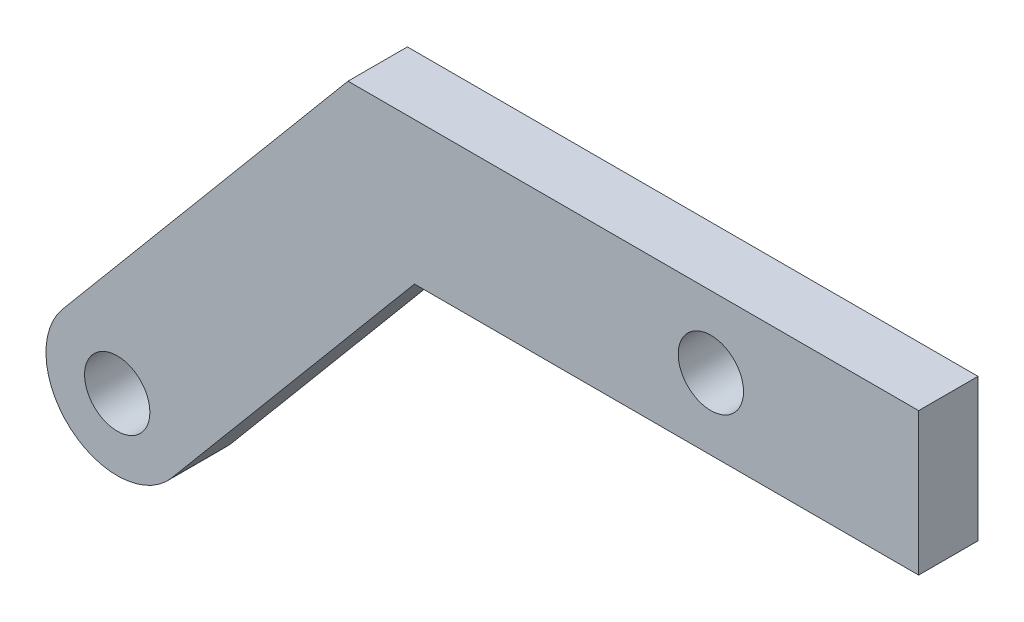
ISO-10303-21;
HEADER;
FILE_DESCRIPTION(('STEP AP214'),'2;1');
FILE_NAME('part.step','',(''),(''),'','','');
FILE_SCHEMA(('AUTOMOTIVE_DESIGN { 1 0 10303 214 1 1 1 1 }'));
ENDSEC;
DATA;
#1=APPLICATION_CONTEXT('core data for automotive mechanical design processes');
#2=APPLICATION_PROTOCOL_DEFINITION('international standard','automotive_design',2000,#1);
#3=PRODUCT_CONTEXT('',#1,'mechanical');
#4=PRODUCT('Part','Part','',(#3));
#5=PRODUCT_RELATED_PRODUCT_CATEGORY('part','',(#4));
#6=PRODUCT_DEFINITION_FORMATION('','',#4);
#7=PRODUCT_DEFINITION_CONTEXT('part definition',#1,'design');
#8=PRODUCT_DEFINITION('design','',#6,#7);
#9=PRODUCT_DEFINITION_SHAPE('','',#8);
#10=(LENGTH_UNIT() NAMED_UNIT(*) SI_UNIT(.MILLI.,.METRE.));
#11=(NAMED_UNIT(*) PLANE_ANGLE_UNIT() SI_UNIT($,.RADIAN.));
#12=(NAMED_UNIT(*) SI_UNIT($,.STERADIAN.) SOLID_ANGLE_UNIT());
#13=UNCERTAINTY_MEASURE_WITH_UNIT(LENGTH_MEASURE(1.E-05),#10,'distance_accuracy_value','');
#14=(GEOMETRIC_REPRESENTATION_CONTEXT(3) GLOBAL_UNCERTAINTY_ASSIGNED_CONTEXT((#13)) GLOBAL_UNIT_ASSIGNED_CONTEXT((#10,
#11,#12)) REPRESENTATION_CONTEXT('',''));
#15=CARTESIAN_POINT('',(0.,0.,0.));
#16=DIRECTION('',(0.,0.,1.));
#17=DIRECTION('',(1.,0.,0.));
#18=AXIS2_PLACEMENT_3D('',#15,#16,#17);
#19=CARTESIAN_POINT('',(0.,0.,10.));
#20=DIRECTION('',(0.,0.,1.));
#21=DIRECTION('',(1.,0.,0.));
#22=AXIS2_PLACEMENT_3D('',#19,#20,#21);
#23=PLANE('',#22);
#24=CARTESIAN_POINT('',(0.,0.,10.));
#25=DIRECTION('',(0.,0.,1.));
#26=DIRECTION('',(1.,0.,0.));
#27=AXIS2_PLACEMENT_3D('',#24,#25,#26);
#28=CIRCLE('',#27,5.5);
#29=CARTESIAN_POINT('',(5.5,0.,10.));
#30=VERTEX_POINT('',#29);
#31=EDGE_CURVE('E138',#30,#30,#28,.T.);
#32=ORIENTED_EDGE('',*,*,#31,.F.);
#33=EDGE_LOOP('',(#32));
#34=FACE_BOUND('',#33,.T.);
#35=DIRECTION('',(-1.,0.,0.));
#36=VECTOR('',#35,1.);
#37=CARTESIAN_POINT('',(135.,65.,10.));
#38=LINE('',#37,#36);
#39=CARTESIAN_POINT('',(135.,65.,10.));
#40=VERTEX_POINT('',#39);
#41=CARTESIAN_POINT('',(38.8765885545357,65.,10.));
#42=VERTEX_POINT('',#41);
#43=EDGE_CURVE('E150',#40,#42,#38,.T.);
#44=ORIENTED_EDGE('',*,*,#43,.T.);
#45=DIRECTION('',(-0.642787609686538,-0.766044443118979,0.));
#46=VECTOR('',#45,1.);
#47=CARTESIAN_POINT('',(38.8765885545357,65.,10.));
#48=LINE('',#47,#46);
#49=CARTESIAN_POINT('',(-9.19253331742775,7.71345131623845,10.));
#50=VERTEX_POINT('',#49);
#51=EDGE_CURVE('E98',#42,#50,#48,.T.);
#52=ORIENTED_EDGE('',*,*,#51,.T.);
#53=CARTESIAN_POINT('',(0.,0.,10.));
#54=DIRECTION('',(0.,0.,1.));
#55=DIRECTION('',(1.,0.,0.));
#56=AXIS2_PLACEMENT_3D('',#53,#54,#55);
#57=CIRCLE('',#56,12.);
#58=CARTESIAN_POINT('',(9.19253331742775,-7.71345131623846,10.));
#59=VERTEX_POINT('',#58);
#60=EDGE_CURVE('E111',#50,#59,#57,.T.);
#61=ORIENTED_EDGE('',*,*,#60,.T.);
#62=DIRECTION('',(0.642787609686538,0.766044443118979,0.));
#63=VECTOR('',#62,1.);
#64=CARTESIAN_POINT('',(9.19253331742775,-7.71345131623846,10.));
#65=LINE('',#64,#63);
#66=CARTESIAN_POINT('',(50.0679723502557,41.,10.));
#67=VERTEX_POINT('',#66);
#68=EDGE_CURVE('E105',#59,#67,#65,.T.);
#69=ORIENTED_EDGE('',*,*,#68,.T.);
#70=DIRECTION('',(1.,0.,0.));
#71=VECTOR('',#70,1.);
#72=CARTESIAN_POINT('',(50.0679723502557,41.,10.));
#73=LINE('',#72,#71);
#74=CARTESIAN_POINT('',(135.,41.,10.));
#75=VERTEX_POINT('',#74);
#76=EDGE_CURVE('E109',#67,#75,#73,.T.);
#77=ORIENTED_EDGE('',*,*,#76,.T.);
#78=DIRECTION('',(0.,1.,0.));
#79=VECTOR('',#78,1.);
#80=CARTESIAN_POINT('',(135.,41.,10.));
#81=LINE('',#80,#79);
#82=EDGE_CURVE('E61',#75,#40,#81,.T.);
#83=ORIENTED_EDGE('',*,*,#82,.T.);
#84=EDGE_LOOP('',(#44,#52,#61,#69,#77,#83));
#85=FACE_BOUND('',#84,.T.);
#86=CARTESIAN_POINT('',(100.,53.,10.));
#87=DIRECTION('',(0.,0.,1.));
#88=DIRECTION('',(1.,0.,0.));
#89=AXIS2_PLACEMENT_3D('',#86,#87,#88);
#90=CIRCLE('',#89,5.5);
#91=CARTESIAN_POINT('',(105.5,53.,10.));
#92=VERTEX_POINT('',#91);
#93=EDGE_CURVE('E196',#92,#92,#90,.T.);
#94=ORIENTED_EDGE('',*,*,#93,.F.);
#95=EDGE_LOOP('',(#94));
#96=FACE_BOUND('',#95,.T.);
#97=ADVANCED_FACE('F43',(#34,#85,#96),#23,.T.);
#98=CARTESIAN_POINT('',(0.,0.,0.));
#99=DIRECTION('',(0.,0.,1.));
#100=DIRECTION('',(1.,0.,0.));
#101=AXIS2_PLACEMENT_3D('',#98,#99,#100);
#102=PLANE('',#101);
#103=DIRECTION('',(-1.,0.,0.));
#104=VECTOR('',#103,1.);
#105=CARTESIAN_POINT('',(135.,65.,0.));
#106=LINE('',#105,#104);
#107=CARTESIAN_POINT('',(135.,65.,0.));
#108=VERTEX_POINT('',#107);
#109=CARTESIAN_POINT('',(38.8765885545357,65.,0.));
#110=VERTEX_POINT('',#109);
#111=EDGE_CURVE('E133',#108,#110,#106,.T.);
#112=ORIENTED_EDGE('',*,*,#111,.F.);
#113=DIRECTION('',(0.,1.,0.));
#114=VECTOR('',#113,1.);
#115=CARTESIAN_POINT('',(135.,41.,0.));
#116=LINE('',#115,#114);
#117=CARTESIAN_POINT('',(135.,41.,0.));
#118=VERTEX_POINT('',#117);
#119=EDGE_CURVE('E90',#118,#108,#116,.T.);
#120=ORIENTED_EDGE('',*,*,#119,.F.);
#121=DIRECTION('',(1.,0.,0.));
#122=VECTOR('',#121,1.);
#123=CARTESIAN_POINT('',(50.0679723502557,41.,0.));
#124=LINE('',#123,#122);
#125=CARTESIAN_POINT('',(50.0679723502557,41.,0.));
#126=VERTEX_POINT('',#125);
#127=EDGE_CURVE('E84',#126,#118,#124,.T.);
#128=ORIENTED_EDGE('',*,*,#127,.F.);
#129=DIRECTION('',(0.642787609686538,0.766044443118979,0.));
#130=VECTOR('',#129,1.);
#131=CARTESIAN_POINT('',(9.19253331742775,-7.71345131623846,0.));
#132=LINE('',#131,#130);
#133=CARTESIAN_POINT('',(9.19253331742775,-7.71345131623846,0.));
#134=VERTEX_POINT('',#133);
#135=EDGE_CURVE('E120',#134,#126,#132,.T.);
#136=ORIENTED_EDGE('',*,*,#135,.F.);
#137=CARTESIAN_POINT('',(0.,0.,0.));
#138=DIRECTION('',(0.,0.,1.));
#139=DIRECTION('',(1.,0.,0.));
#140=AXIS2_PLACEMENT_3D('',#137,#138,#139);
#141=CIRCLE('',#140,12.);
#142=CARTESIAN_POINT('',(-9.19253331742775,7.71345131623845,0.));
#143=VERTEX_POINT('',#142);
#144=EDGE_CURVE('E141',#143,#134,#141,.T.);
#145=ORIENTED_EDGE('',*,*,#144,.F.);
#146=DIRECTION('',(-0.642787609686538,-0.766044443118979,0.));
#147=VECTOR('',#146,1.);
#148=CARTESIAN_POINT('',(38.8765885545357,65.,0.));
#149=LINE('',#148,#147);
#150=EDGE_CURVE('E137',#110,#143,#149,.T.);
#151=ORIENTED_EDGE('',*,*,#150,.F.);
#152=EDGE_LOOP('',(#112,#120,#128,#136,#145,#151));
#153=FACE_BOUND('',#152,.T.);
#154=CARTESIAN_POINT('',(0.,0.,0.));
#155=DIRECTION('',(0.,0.,1.));
#156=DIRECTION('',(1.,0.,0.));
#157=AXIS2_PLACEMENT_3D('',#154,#155,#156);
#158=CIRCLE('',#157,5.5);
#159=CARTESIAN_POINT('',(5.5,0.,0.));
#160=VERTEX_POINT('',#159);
#161=EDGE_CURVE('E204',#160,#160,#158,.T.);
#162=ORIENTED_EDGE('',*,*,#161,.T.);
#163=EDGE_LOOP('',(#162));
#164=FACE_BOUND('',#163,.T.);
#165=CARTESIAN_POINT('',(100.,53.,0.));
#166=DIRECTION('',(0.,0.,1.));
#167=DIRECTION('',(1.,0.,0.));
#168=AXIS2_PLACEMENT_3D('',#165,#166,#167);
#169=CIRCLE('',#168,5.5);
#170=CARTESIAN_POINT('',(105.5,53.,0.));
#171=VERTEX_POINT('',#170);
#172=EDGE_CURVE('E199',#171,#171,#169,.T.);
#173=ORIENTED_EDGE('',*,*,#172,.T.);
#174=EDGE_LOOP('',(#173));
#175=FACE_BOUND('',#174,.T.);
#176=ADVANCED_FACE('F163',(#153,#164,#175),#102,.F.);
#177=CARTESIAN_POINT('',(135.,65.,10.));
#178=DIRECTION('',(0.,-1.,0.));
#179=DIRECTION('',(1.,0.,0.));
#180=AXIS2_PLACEMENT_3D('',#177,#178,#179);
#181=PLANE('',#180);
#182=ORIENTED_EDGE('',*,*,#111,.T.);
#183=DIRECTION('',(0.,0.,-1.));
#184=VECTOR('',#183,1.);
#185=CARTESIAN_POINT('',(38.8765885545357,65.,10.));
#186=LINE('',#185,#184);
#187=EDGE_CURVE('E11',#42,#110,#186,.T.);
#188=ORIENTED_EDGE('',*,*,#187,.F.);
#189=ORIENTED_EDGE('',*,*,#43,.F.);
#190=DIRECTION('',(0.,0.,-1.));
#191=VECTOR('',#190,1.);
#192=CARTESIAN_POINT('',(135.,65.,10.));
#193=LINE('',#192,#191);
#194=EDGE_CURVE('E129',#40,#108,#193,.T.);
#195=ORIENTED_EDGE('',*,*,#194,.T.);
#196=EDGE_LOOP('',(#182,#188,#189,#195));
#197=FACE_BOUND('',#196,.T.);
#198=ADVANCED_FACE('F45',(#197),#181,.F.);
#199=CARTESIAN_POINT('',(38.8765885545357,65.,10.));
#200=DIRECTION('',(0.766044443118979,-0.642787609686538,0.));
#201=DIRECTION('',(0.642787609686538,0.76604444311898,0.));
#202=AXIS2_PLACEMENT_3D('',#199,#200,#201);
#203=PLANE('',#202);
#204=ORIENTED_EDGE('',*,*,#150,.T.);
#205=DIRECTION('',(0.,0.,-1.));
#206=VECTOR('',#205,1.);
#207=CARTESIAN_POINT('',(-9.19253331742775,7.71345131623845,10.));
#208=LINE('',#207,#206);
#209=EDGE_CURVE('E53',#50,#143,#208,.T.);
#210=ORIENTED_EDGE('',*,*,#209,.F.);
#211=ORIENTED_EDGE('',*,*,#51,.F.);
#212=ORIENTED_EDGE('',*,*,#187,.T.);
#213=EDGE_LOOP('',(#204,#210,#211,#212));
#214=FACE_BOUND('',#213,.T.);
#215=ADVANCED_FACE('F254',(#214),#203,.F.);
#216=CARTESIAN_POINT('',(0.,0.,10.));
#217=DIRECTION('',(0.,0.,-1.));
#218=DIRECTION('',(-1.,0.,0.));
#219=AXIS2_PLACEMENT_3D('',#216,#217,#218);
#220=CYLINDRICAL_SURFACE('',#219,12.);
#221=ORIENTED_EDGE('',*,*,#144,.T.);
#222=DIRECTION('',(0.,0.,-1.));
#223=VECTOR('',#222,1.);
#224=CARTESIAN_POINT('',(9.19253331742775,-7.71345131623846,10.));
#225=LINE('',#224,#223);
#226=EDGE_CURVE('E122',#59,#134,#225,.T.);
#227=ORIENTED_EDGE('',*,*,#226,.F.);
#228=ORIENTED_EDGE('',*,*,#60,.F.);
#229=ORIENTED_EDGE('',*,*,#209,.T.);
#230=EDGE_LOOP('',(#221,#227,#228,#229));
#231=FACE_BOUND('',#230,.T.);
#232=ADVANCED_FACE('F160',(#231),#220,.T.);
#233=CARTESIAN_POINT('',(9.19253331742775,-7.71345131623846,10.));
#234=DIRECTION('',(-0.766044443118979,0.642787609686538,0.));
#235=DIRECTION('',(-0.642787609686538,-0.766044443118979,0.));
#236=AXIS2_PLACEMENT_3D('',#233,#234,#235);
#237=PLANE('',#236);
#238=ORIENTED_EDGE('',*,*,#135,.T.);
#239=DIRECTION('',(0.,0.,-1.));
#240=VECTOR('',#239,1.);
#241=CARTESIAN_POINT('',(50.0679723502557,41.,10.));
#242=LINE('',#241,#240);
#243=EDGE_CURVE('E117',#67,#126,#242,.T.);
#244=ORIENTED_EDGE('',*,*,#243,.F.);
#245=ORIENTED_EDGE('',*,*,#68,.F.);
#246=ORIENTED_EDGE('',*,*,#226,.T.);
#247=EDGE_LOOP('',(#238,#244,#245,#246));
#248=FACE_BOUND('',#247,.T.);
#249=ADVANCED_FACE('F118',(#248),#237,.F.);
#250=CARTESIAN_POINT('',(50.0679723502557,41.,10.));
#251=DIRECTION('',(0.,1.,0.));
#252=DIRECTION('',(-1.,0.,0.));
#253=AXIS2_PLACEMENT_3D('',#250,#251,#252);
#254=PLANE('',#253);
#255=ORIENTED_EDGE('',*,*,#127,.T.);
#256=DIRECTION('',(0.,0.,-1.));
#257=VECTOR('',#256,1.);
#258=CARTESIAN_POINT('',(135.,41.,10.));
#259=LINE('',#258,#257);
#260=EDGE_CURVE('E123',#75,#118,#259,.T.);
#261=ORIENTED_EDGE('',*,*,#260,.F.);
#262=ORIENTED_EDGE('',*,*,#76,.F.);
#263=ORIENTED_EDGE('',*,*,#243,.T.);
#264=EDGE_LOOP('',(#255,#261,#262,#263));
#265=FACE_BOUND('',#264,.T.);
#266=ADVANCED_FACE('F125',(#265),#254,.F.);
#267=CARTESIAN_POINT('',(135.,41.,10.));
#268=DIRECTION('',(-1.,0.,0.));
#269=DIRECTION('',(0.,0.,1.));
#270=AXIS2_PLACEMENT_3D('',#267,#268,#269);
#271=PLANE('',#270);
#272=ORIENTED_EDGE('',*,*,#119,.T.);
#273=ORIENTED_EDGE('',*,*,#194,.F.);
#274=ORIENTED_EDGE('',*,*,#82,.F.);
#275=ORIENTED_EDGE('',*,*,#260,.T.);
#276=EDGE_LOOP('',(#272,#273,#274,#275));
#277=FACE_BOUND('',#276,.T.);
#278=ADVANCED_FACE('F168',(#277),#271,.F.);
#279=CARTESIAN_POINT('',(0.,0.,10.));
#280=DIRECTION('',(0.,0.,-1.));
#281=DIRECTION('',(-1.,0.,0.));
#282=AXIS2_PLACEMENT_3D('',#279,#280,#281);
#283=CYLINDRICAL_SURFACE('',#282,5.5);
#284=ORIENTED_EDGE('',*,*,#31,.T.);
#285=EDGE_LOOP('',(#284));
#286=FACE_BOUND('',#285,.T.);
#287=ORIENTED_EDGE('',*,*,#161,.F.);
#288=EDGE_LOOP('',(#287));
#289=FACE_BOUND('',#288,.T.);
#290=ADVANCED_FACE('F170',(#286,#289),#283,.F.);
#291=CARTESIAN_POINT('',(100.,53.,10.));
#292=DIRECTION('',(0.,0.,-1.));
#293=DIRECTION('',(-1.,0.,0.));
#294=AXIS2_PLACEMENT_3D('',#291,#292,#293);
#295=CYLINDRICAL_SURFACE('',#294,5.5);
#296=ORIENTED_EDGE('',*,*,#93,.T.);
#297=EDGE_LOOP('',(#296));
#298=FACE_BOUND('',#297,.T.);
#299=ORIENTED_EDGE('',*,*,#172,.F.);
#300=EDGE_LOOP('',(#299));
#301=FACE_BOUND('',#300,.T.);
#302=ADVANCED_FACE('F176',(#298,#301),#295,.F.);
#303=CLOSED_SHELL('',(#97,#176,#198,#215,#232,#249,#266,#278,#290,#302));
#304=MANIFOLD_SOLID_BREP('B2',#303);
#305=ADVANCED_BREP_SHAPE_REPRESENTATION('',(#18,#304),#14);
#306=SHAPE_DEFINITION_REPRESENTATION(#9,#305);
ENDSEC;
END-ISO-10303-21;
